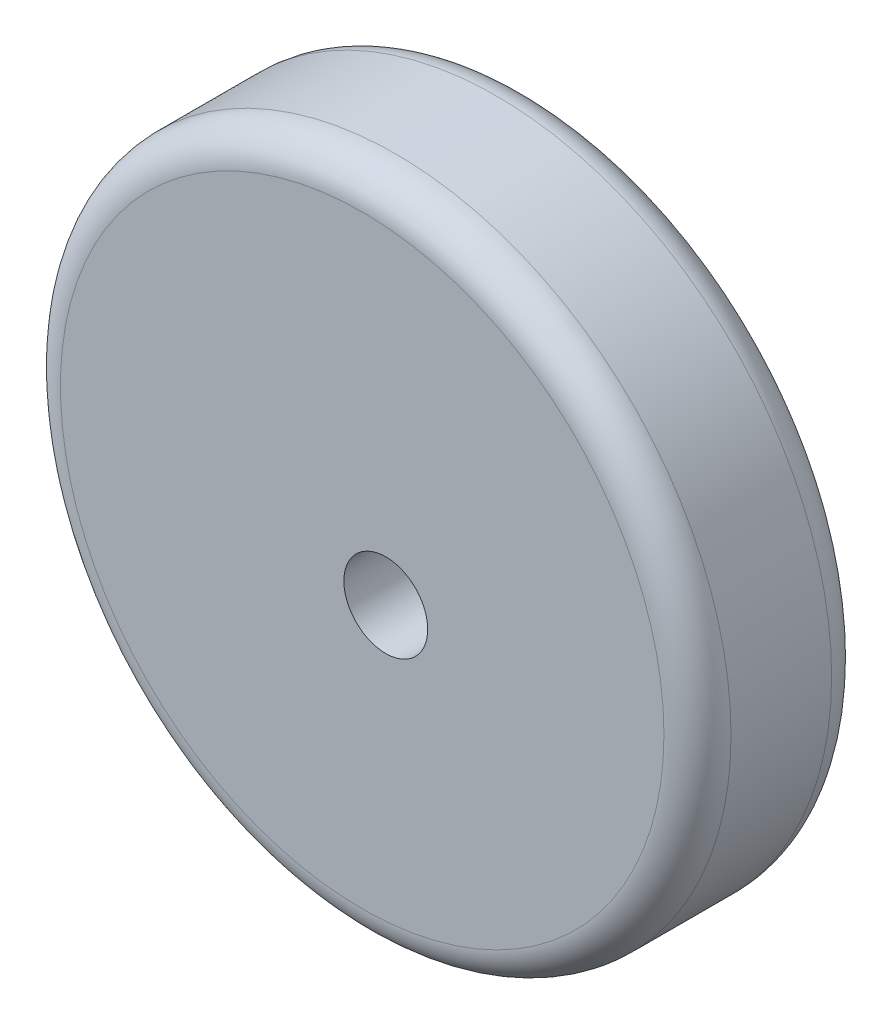
ISO-10303-21;
HEADER;
FILE_DESCRIPTION(('STEP AP214'),'2;1');
FILE_NAME('part.step','',(''),(''),'','','');
FILE_SCHEMA(('AUTOMOTIVE_DESIGN { 1 0 10303 214 1 1 1 1 }'));
ENDSEC;
DATA;
#1=APPLICATION_CONTEXT('core data for automotive mechanical design processes');
#2=APPLICATION_PROTOCOL_DEFINITION('international standard','automotive_design',2000,#1);
#3=PRODUCT_CONTEXT('',#1,'mechanical');
#4=PRODUCT('Part','Part','',(#3));
#5=PRODUCT_RELATED_PRODUCT_CATEGORY('part','',(#4));
#6=PRODUCT_DEFINITION_FORMATION('','',#4);
#7=PRODUCT_DEFINITION_CONTEXT('part definition',#1,'design');
#8=PRODUCT_DEFINITION('design','',#6,#7);
#9=PRODUCT_DEFINITION_SHAPE('','',#8);
#10=(LENGTH_UNIT() NAMED_UNIT(*) SI_UNIT(.MILLI.,.METRE.));
#11=(NAMED_UNIT(*) PLANE_ANGLE_UNIT() SI_UNIT($,.RADIAN.));
#12=(NAMED_UNIT(*) SI_UNIT($,.STERADIAN.) SOLID_ANGLE_UNIT());
#13=UNCERTAINTY_MEASURE_WITH_UNIT(LENGTH_MEASURE(1.E-05),#10,'distance_accuracy_value','');
#14=(GEOMETRIC_REPRESENTATION_CONTEXT(3) GLOBAL_UNCERTAINTY_ASSIGNED_CONTEXT((#13)) GLOBAL_UNIT_ASSIGNED_CONTEXT((#10,
#11,#12)) REPRESENTATION_CONTEXT('',''));
#15=CARTESIAN_POINT('',(0.,0.,0.));
#16=DIRECTION('',(0.,0.,1.));
#17=DIRECTION('',(1.,0.,0.));
#18=AXIS2_PLACEMENT_3D('',#15,#16,#17);
#19=CARTESIAN_POINT('',(-30.291010943861,15.9181554243094,12.7));
#20=DIRECTION('',(0.,0.,-1.));
#21=DIRECTION('',(-1.,0.,0.));
#22=AXIS2_PLACEMENT_3D('',#19,#20,#21);
#23=CYLINDRICAL_SURFACE('',#22,25.4);
#24=CARTESIAN_POINT('',(-30.291010943861,15.9181554243094,2.54));
#25=DIRECTION('',(0.,0.,1.));
#26=DIRECTION('',(1.,0.,0.));
#27=AXIS2_PLACEMENT_3D('',#24,#25,#26);
#28=CIRCLE('',#27,25.4);
#29=CARTESIAN_POINT('',(-4.89101094386095,15.9181554243094,2.54));
#30=VERTEX_POINT('',#29);
#31=EDGE_CURVE('E44',#30,#30,#28,.T.);
#32=ORIENTED_EDGE('',*,*,#31,.T.);
#33=EDGE_LOOP('',(#32));
#34=FACE_BOUND('',#33,.T.);
#35=CARTESIAN_POINT('',(-30.291010943861,15.9181554243094,10.16));
#36=DIRECTION('',(0.,0.,1.));
#37=DIRECTION('',(1.,0.,0.));
#38=AXIS2_PLACEMENT_3D('',#35,#36,#37);
#39=CIRCLE('',#38,25.4);
#40=CARTESIAN_POINT('',(-4.89101094386095,15.9181554243094,10.16));
#41=VERTEX_POINT('',#40);
#42=EDGE_CURVE('E49',#41,#41,#39,.F.);
#43=ORIENTED_EDGE('',*,*,#42,.T.);
#44=EDGE_LOOP('',(#43));
#45=FACE_BOUND('',#44,.T.);
#46=ADVANCED_FACE('F36',(#34,#45),#23,.T.);
#47=CARTESIAN_POINT('',(-30.291010943861,15.9181554243094,12.7));
#48=DIRECTION('',(0.,0.,1.));
#49=DIRECTION('',(1.,0.,0.));
#50=AXIS2_PLACEMENT_3D('',#47,#48,#49);
#51=PLANE('',#50);
#52=CARTESIAN_POINT('',(-28.5013872795901,13.8745106167448,12.7));
#53=DIRECTION('',(0.,0.,-1.));
#54=DIRECTION('',(-1.,0.,0.));
#55=AXIS2_PLACEMENT_3D('',#52,#53,#54);
#56=CIRCLE('',#55,3.175);
#57=CARTESIAN_POINT('',(-31.6763872795901,13.8745106167448,12.7));
#58=VERTEX_POINT('',#57);
#59=EDGE_CURVE('E60',#58,#58,#56,.T.);
#60=ORIENTED_EDGE('',*,*,#59,.T.);
#61=EDGE_LOOP('',(#60));
#62=FACE_BOUND('',#61,.T.);
#63=CARTESIAN_POINT('',(-30.291010943861,15.9181554243094,12.7));
#64=DIRECTION('',(0.,0.,1.));
#65=DIRECTION('',(1.,0.,0.));
#66=AXIS2_PLACEMENT_3D('',#63,#64,#65);
#67=CIRCLE('',#66,22.86);
#68=CARTESIAN_POINT('',(-7.43101094386095,15.9181554243094,12.7));
#69=VERTEX_POINT('',#68);
#70=EDGE_CURVE('E54',#69,#69,#67,.T.);
#71=ORIENTED_EDGE('',*,*,#70,.T.);
#72=EDGE_LOOP('',(#71));
#73=FACE_BOUND('',#72,.T.);
#74=ADVANCED_FACE('F74',(#62,#73),#51,.T.);
#75=CARTESIAN_POINT('',(-30.291010943861,15.9181554243094,0.));
#76=DIRECTION('',(0.,0.,1.));
#77=DIRECTION('',(1.,0.,0.));
#78=AXIS2_PLACEMENT_3D('',#75,#76,#77);
#79=PLANE('',#78);
#80=CARTESIAN_POINT('',(-28.5013872795901,13.8745106167448,0.));
#81=DIRECTION('',(0.,0.,-1.));
#82=DIRECTION('',(-1.,0.,0.));
#83=AXIS2_PLACEMENT_3D('',#80,#81,#82);
#84=CIRCLE('',#83,3.17499999999999);
#85=CARTESIAN_POINT('',(-31.67638727959,13.8745106167448,0.));
#86=VERTEX_POINT('',#85);
#87=EDGE_CURVE('E64',#86,#86,#84,.T.);
#88=ORIENTED_EDGE('',*,*,#87,.F.);
#89=EDGE_LOOP('',(#88));
#90=FACE_BOUND('',#89,.T.);
#91=CARTESIAN_POINT('',(-30.291010943861,15.9181554243094,0.));
#92=DIRECTION('',(0.,0.,1.));
#93=DIRECTION('',(1.,0.,0.));
#94=AXIS2_PLACEMENT_3D('',#91,#92,#93);
#95=CIRCLE('',#94,22.86);
#96=CARTESIAN_POINT('',(-7.43101094386095,15.9181554243094,0.));
#97=VERTEX_POINT('',#96);
#98=EDGE_CURVE('E10',#97,#97,#95,.F.);
#99=ORIENTED_EDGE('',*,*,#98,.T.);
#100=EDGE_LOOP('',(#99));
#101=FACE_BOUND('',#100,.T.);
#102=ADVANCED_FACE('F71',(#90,#101),#79,.F.);
#103=CARTESIAN_POINT('',(-30.291010943861,15.9181554243094,10.16));
#104=DIRECTION('',(0.,0.,1.));
#105=DIRECTION('',(1.,0.,0.));
#106=AXIS2_PLACEMENT_3D('',#103,#104,#105);
#107=TOROIDAL_SURFACE('',#106,22.86,2.54);
#108=ORIENTED_EDGE('',*,*,#42,.F.);
#109=EDGE_LOOP('',(#108));
#110=FACE_BOUND('',#109,.T.);
#111=ORIENTED_EDGE('',*,*,#70,.F.);
#112=EDGE_LOOP('',(#111));
#113=FACE_BOUND('',#112,.T.);
#114=ADVANCED_FACE('F73',(#110,#113),#107,.T.);
#115=CARTESIAN_POINT('',(-30.291010943861,15.9181554243094,2.54));
#116=DIRECTION('',(0.,0.,1.));
#117=DIRECTION('',(1.,0.,0.));
#118=AXIS2_PLACEMENT_3D('',#115,#116,#117);
#119=TOROIDAL_SURFACE('',#118,22.86,2.54);
#120=ORIENTED_EDGE('',*,*,#98,.F.);
#121=EDGE_LOOP('',(#120));
#122=FACE_BOUND('',#121,.T.);
#123=ORIENTED_EDGE('',*,*,#31,.F.);
#124=EDGE_LOOP('',(#123));
#125=FACE_BOUND('',#124,.T.);
#126=ADVANCED_FACE('F38',(#122,#125),#119,.T.);
#127=CARTESIAN_POINT('',(-28.5013872795901,13.8745106167448,0.));
#128=DIRECTION('',(0.,0.,-1.));
#129=DIRECTION('',(-1.,0.,0.));
#130=AXIS2_PLACEMENT_3D('',#127,#128,#129);
#131=CYLINDRICAL_SURFACE('',#130,3.17499999999999);
#132=ORIENTED_EDGE('',*,*,#59,.F.);
#133=EDGE_LOOP('',(#132));
#134=FACE_BOUND('',#133,.T.);
#135=ORIENTED_EDGE('',*,*,#87,.T.);
#136=EDGE_LOOP('',(#135));
#137=FACE_BOUND('',#136,.T.);
#138=ADVANCED_FACE('F69',(#134,#137),#131,.F.);
#139=CLOSED_SHELL('',(#46,#74,#102,#114,#126,#138));
#140=MANIFOLD_SOLID_BREP('B2',#139);
#141=ADVANCED_BREP_SHAPE_REPRESENTATION('',(#18,#140),#14);
#142=SHAPE_DEFINITION_REPRESENTATION(#9,#141);
ENDSEC;
END-ISO-10303-21;
